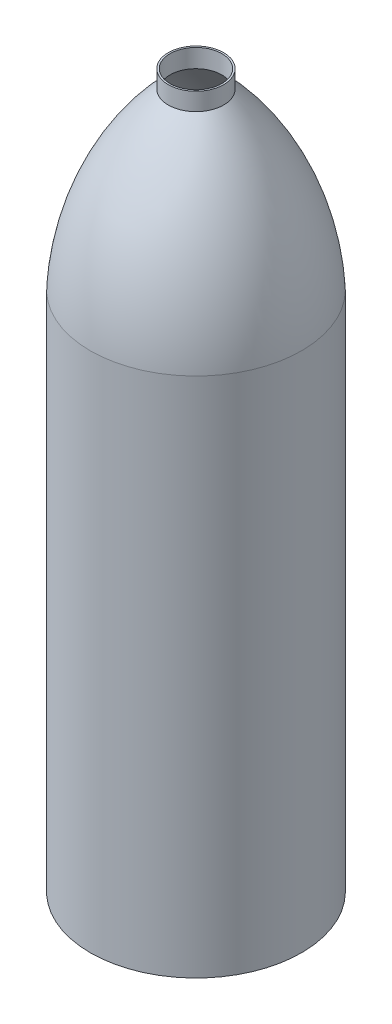
ISO-10303-21;
HEADER;
FILE_DESCRIPTION(('STEP AP214'),'2;1');
FILE_NAME('part.step','',(''),(''),'','','');
FILE_SCHEMA(('AUTOMOTIVE_DESIGN { 1 0 10303 214 1 1 1 1 }'));
ENDSEC;
DATA;
#1=APPLICATION_CONTEXT('core data for automotive mechanical design processes');
#2=APPLICATION_PROTOCOL_DEFINITION('international standard','automotive_design',2000,#1);
#3=PRODUCT_CONTEXT('',#1,'mechanical');
#4=PRODUCT('Part','Part','',(#3));
#5=PRODUCT_RELATED_PRODUCT_CATEGORY('part','',(#4));
#6=PRODUCT_DEFINITION_FORMATION('','',#4);
#7=PRODUCT_DEFINITION_CONTEXT('part definition',#1,'design');
#8=PRODUCT_DEFINITION('design','',#6,#7);
#9=PRODUCT_DEFINITION_SHAPE('','',#8);
#10=(LENGTH_UNIT() NAMED_UNIT(*) SI_UNIT(.MILLI.,.METRE.));
#11=(NAMED_UNIT(*) PLANE_ANGLE_UNIT() SI_UNIT($,.RADIAN.));
#12=(NAMED_UNIT(*) SI_UNIT($,.STERADIAN.) SOLID_ANGLE_UNIT());
#13=UNCERTAINTY_MEASURE_WITH_UNIT(LENGTH_MEASURE(1.E-05),#10,'distance_accuracy_value','');
#14=(GEOMETRIC_REPRESENTATION_CONTEXT(3) GLOBAL_UNCERTAINTY_ASSIGNED_CONTEXT((#13)) GLOBAL_UNIT_ASSIGNED_CONTEXT((#10,
#11,#12)) REPRESENTATION_CONTEXT('',''));
#15=CARTESIAN_POINT('',(0.,0.,0.));
#16=DIRECTION('',(0.,0.,1.));
#17=DIRECTION('',(1.,0.,0.));
#18=AXIS2_PLACEMENT_3D('',#15,#16,#17);
#19=CARTESIAN_POINT('',(0.,-44.1576557414236,0.));
#20=DIRECTION('',(0.,1.,0.));
#21=DIRECTION('',(0.,0.,1.));
#22=AXIS2_PLACEMENT_3D('',#19,#20,#21);
#23=PLANE('',#22);
#24=CARTESIAN_POINT('',(0.,-44.1576557414236,0.));
#25=DIRECTION('',(0.,1.,0.));
#26=DIRECTION('',(0.,0.,1.));
#27=AXIS2_PLACEMENT_3D('',#24,#25,#26);
#28=CIRCLE('',#27,60.);
#29=CARTESIAN_POINT('',(0.,-44.1576557414236,60.));
#30=VERTEX_POINT('',#29);
#31=EDGE_CURVE('E10',#30,#30,#28,.T.);
#32=ORIENTED_EDGE('',*,*,#31,.T.);
#33=EDGE_LOOP('',(#32));
#34=FACE_BOUND('',#33,.T.);
#35=ADVANCED_FACE('F31',(#34),#23,.T.);
#36=CARTESIAN_POINT('',(0.,434.739798995383,0.));
#37=DIRECTION('',(0.,1.,0.));
#38=DIRECTION('',(0.,0.,1.));
#39=AXIS2_PLACEMENT_3D('',#36,#37,#38);
#40=CYLINDRICAL_SURFACE('',#39,60.);
#41=CARTESIAN_POINT('',(0.,255.842344258576,0.));
#42=DIRECTION('',(0.,1.,0.));
#43=DIRECTION('',(0.,0.,1.));
#44=AXIS2_PLACEMENT_3D('',#41,#42,#43);
#45=CIRCLE('',#44,60.);
#46=CARTESIAN_POINT('',(0.,255.842344258576,60.));
#47=VERTEX_POINT('',#46);
#48=EDGE_CURVE('E37',#47,#47,#45,.T.);
#49=ORIENTED_EDGE('',*,*,#48,.T.);
#50=EDGE_LOOP('',(#49));
#51=FACE_BOUND('',#50,.T.);
#52=ORIENTED_EDGE('',*,*,#31,.F.);
#53=EDGE_LOOP('',(#52));
#54=FACE_BOUND('',#53,.T.);
#55=ADVANCED_FACE('F75',(#51,#54),#40,.F.);
#56=CARTESIAN_POINT('',(0.,247.498732270209,0.));
#57=DIRECTION('',(0.,1.,0.));
#58=DIRECTION('',(0.,0.,1.));
#59=AXIS2_PLACEMENT_3D('',#56,#57,#58);
#60=DEGENERATE_TOROIDAL_SURFACE('',#59,92.1524710852614,152.381069422562,.F.);
#61=CARTESIAN_POINT('',(0.,355.842344258576,0.));
#62=DIRECTION('',(0.,1.,0.));
#63=DIRECTION('',(0.,0.,1.));
#64=AXIS2_PLACEMENT_3D('',#61,#62,#63);
#65=CIRCLE('',#64,15.);
#66=CARTESIAN_POINT('',(0.,355.842344258576,15.));
#67=VERTEX_POINT('',#66);
#68=EDGE_CURVE('E41',#67,#67,#65,.T.);
#69=ORIENTED_EDGE('',*,*,#68,.T.);
#70=EDGE_LOOP('',(#69));
#71=FACE_BOUND('',#70,.T.);
#72=ORIENTED_EDGE('',*,*,#48,.F.);
#73=EDGE_LOOP('',(#72));
#74=FACE_BOUND('',#73,.T.);
#75=ADVANCED_FACE('F79',(#71,#74),#60,.T.);
#76=CARTESIAN_POINT('',(0.,434.739798995383,0.));
#77=DIRECTION('',(0.,1.,0.));
#78=DIRECTION('',(0.,0.,1.));
#79=AXIS2_PLACEMENT_3D('',#76,#77,#78);
#80=CYLINDRICAL_SURFACE('',#79,15.);
#81=CARTESIAN_POINT('',(0.,366.473388743772,0.));
#82=DIRECTION('',(0.,1.,0.));
#83=DIRECTION('',(0.,0.,1.));
#84=AXIS2_PLACEMENT_3D('',#81,#82,#83);
#85=CIRCLE('',#84,15.);
#86=CARTESIAN_POINT('',(0.,366.473388743772,15.));
#87=VERTEX_POINT('',#86);
#88=EDGE_CURVE('E45',#87,#87,#85,.T.);
#89=ORIENTED_EDGE('',*,*,#88,.T.);
#90=EDGE_LOOP('',(#89));
#91=FACE_BOUND('',#90,.T.);
#92=ORIENTED_EDGE('',*,*,#68,.F.);
#93=EDGE_LOOP('',(#92));
#94=FACE_BOUND('',#93,.T.);
#95=ADVANCED_FACE('F83',(#91,#94),#80,.F.);
#96=CARTESIAN_POINT('',(-16.,366.473388743772,0.));
#97=DIRECTION('',(0.,1.,0.));
#98=DIRECTION('',(0.,0.,1.));
#99=AXIS2_PLACEMENT_3D('',#96,#97,#98);
#100=PLANE('',#99);
#101=CARTESIAN_POINT('',(0.,366.473388743772,0.));
#102=DIRECTION('',(0.,1.,0.));
#103=DIRECTION('',(0.,0.,1.));
#104=AXIS2_PLACEMENT_3D('',#101,#102,#103);
#105=CIRCLE('',#104,16.);
#106=CARTESIAN_POINT('',(0.,366.473388743772,16.));
#107=VERTEX_POINT('',#106);
#108=EDGE_CURVE('E50',#107,#107,#105,.T.);
#109=ORIENTED_EDGE('',*,*,#108,.T.);
#110=EDGE_LOOP('',(#109));
#111=FACE_BOUND('',#110,.T.);
#112=ORIENTED_EDGE('',*,*,#88,.F.);
#113=EDGE_LOOP('',(#112));
#114=FACE_BOUND('',#113,.T.);
#115=ADVANCED_FACE('F90',(#111,#114),#100,.T.);
#116=CARTESIAN_POINT('',(0.,434.739798995383,0.));
#117=DIRECTION('',(0.,1.,0.));
#118=DIRECTION('',(0.,0.,1.));
#119=AXIS2_PLACEMENT_3D('',#116,#117,#118);
#120=CYLINDRICAL_SURFACE('',#119,16.);
#121=CARTESIAN_POINT('',(0.,356.258998247084,0.));
#122=DIRECTION('',(0.,1.,0.));
#123=DIRECTION('',(0.,0.,1.));
#124=AXIS2_PLACEMENT_3D('',#121,#122,#123);
#125=CIRCLE('',#124,16.);
#126=CARTESIAN_POINT('',(0.,356.258998247084,16.));
#127=VERTEX_POINT('',#126);
#128=EDGE_CURVE('E53',#127,#127,#125,.T.);
#129=ORIENTED_EDGE('',*,*,#128,.T.);
#130=EDGE_LOOP('',(#129));
#131=FACE_BOUND('',#130,.T.);
#132=ORIENTED_EDGE('',*,*,#108,.F.);
#133=EDGE_LOOP('',(#132));
#134=FACE_BOUND('',#133,.T.);
#135=ADVANCED_FACE('F94',(#131,#134),#120,.T.);
#136=CARTESIAN_POINT('',(0.,247.498732270209,0.));
#137=DIRECTION('',(0.,1.,0.));
#138=DIRECTION('',(0.,0.,1.));
#139=AXIS2_PLACEMENT_3D('',#136,#137,#138);
#140=DEGENERATE_TOROIDAL_SURFACE('',#139,92.1524710852614,153.381069422562,.F.);
#141=CARTESIAN_POINT('',(0.,255.869697428841,0.));
#142=DIRECTION('',(0.,1.,0.));
#143=DIRECTION('',(0.,0.,1.));
#144=AXIS2_PLACEMENT_3D('',#141,#142,#143);
#145=CIRCLE('',#144,61.);
#146=CARTESIAN_POINT('',(0.,255.869697428841,61.));
#147=VERTEX_POINT('',#146);
#148=EDGE_CURVE('E56',#147,#147,#145,.T.);
#149=ORIENTED_EDGE('',*,*,#148,.T.);
#150=EDGE_LOOP('',(#149));
#151=FACE_BOUND('',#150,.T.);
#152=ORIENTED_EDGE('',*,*,#128,.F.);
#153=EDGE_LOOP('',(#152));
#154=FACE_BOUND('',#153,.T.);
#155=ADVANCED_FACE('F72',(#151,#154),#140,.F.);
#156=CARTESIAN_POINT('',(0.,434.739798995383,0.));
#157=DIRECTION('',(0.,1.,0.));
#158=DIRECTION('',(0.,0.,1.));
#159=AXIS2_PLACEMENT_3D('',#156,#157,#158);
#160=CYLINDRICAL_SURFACE('',#159,61.);
#161=CARTESIAN_POINT('',(0.,-45.1576557414236,0.));
#162=DIRECTION('',(0.,1.,0.));
#163=DIRECTION('',(0.,0.,1.));
#164=AXIS2_PLACEMENT_3D('',#161,#162,#163);
#165=CIRCLE('',#164,61.);
#166=CARTESIAN_POINT('',(0.,-45.1576557414236,61.));
#167=VERTEX_POINT('',#166);
#168=EDGE_CURVE('E59',#167,#167,#165,.T.);
#169=ORIENTED_EDGE('',*,*,#168,.T.);
#170=EDGE_LOOP('',(#169));
#171=FACE_BOUND('',#170,.T.);
#172=ORIENTED_EDGE('',*,*,#148,.F.);
#173=EDGE_LOOP('',(#172));
#174=FACE_BOUND('',#173,.T.);
#175=ADVANCED_FACE('F63',(#171,#174),#160,.T.);
#176=CARTESIAN_POINT('',(0.,-45.1576557414236,0.));
#177=DIRECTION('',(0.,-1.,0.));
#178=DIRECTION('',(0.,0.,-1.));
#179=AXIS2_PLACEMENT_3D('',#176,#177,#178);
#180=PLANE('',#179);
#181=ORIENTED_EDGE('',*,*,#168,.F.);
#182=EDGE_LOOP('',(#181));
#183=FACE_BOUND('',#182,.T.);
#184=ADVANCED_FACE('F66',(#183),#180,.T.);
#185=CLOSED_SHELL('',(#35,#55,#75,#95,#115,#135,#155,#175,#184));
#186=MANIFOLD_SOLID_BREP('B2',#185);
#187=ADVANCED_BREP_SHAPE_REPRESENTATION('',(#18,#186),#14);
#188=SHAPE_DEFINITION_REPRESENTATION(#9,#187);
ENDSEC;
END-ISO-10303-21;
